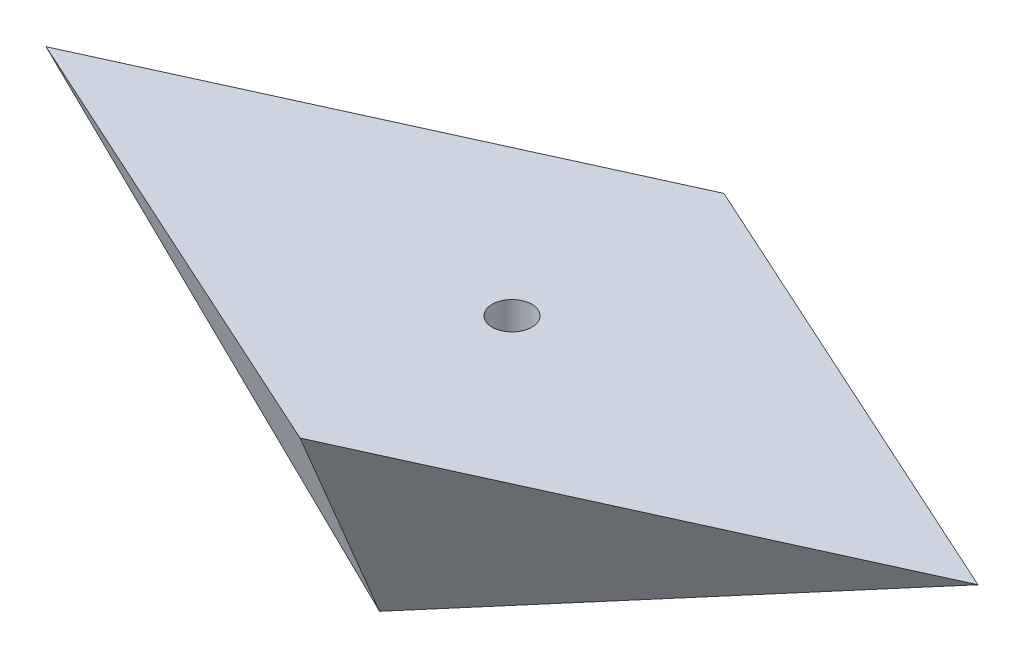
ISO-10303-21;
HEADER;
FILE_DESCRIPTION(('STEP AP214'),'2;1');
FILE_NAME('part.step','',(''),(''),'','','');
FILE_SCHEMA(('AUTOMOTIVE_DESIGN { 1 0 10303 214 1 1 1 1 }'));
ENDSEC;
DATA;
#1=APPLICATION_CONTEXT('core data for automotive mechanical design processes');
#2=APPLICATION_PROTOCOL_DEFINITION('international standard','automotive_design',2000,#1);
#3=PRODUCT_CONTEXT('',#1,'mechanical');
#4=PRODUCT('Part','Part','',(#3));
#5=PRODUCT_RELATED_PRODUCT_CATEGORY('part','',(#4));
#6=PRODUCT_DEFINITION_FORMATION('','',#4);
#7=PRODUCT_DEFINITION_CONTEXT('part definition',#1,'design');
#8=PRODUCT_DEFINITION('design','',#6,#7);
#9=PRODUCT_DEFINITION_SHAPE('','',#8);
#10=(LENGTH_UNIT() NAMED_UNIT(*) SI_UNIT(.MILLI.,.METRE.));
#11=(NAMED_UNIT(*) PLANE_ANGLE_UNIT() SI_UNIT($,.RADIAN.));
#12=(NAMED_UNIT(*) SI_UNIT($,.STERADIAN.) SOLID_ANGLE_UNIT());
#13=UNCERTAINTY_MEASURE_WITH_UNIT(LENGTH_MEASURE(1.E-05),#10,'distance_accuracy_value','');
#14=(GEOMETRIC_REPRESENTATION_CONTEXT(3) GLOBAL_UNCERTAINTY_ASSIGNED_CONTEXT((#13)) GLOBAL_UNIT_ASSIGNED_CONTEXT((#10,
#11,#12)) REPRESENTATION_CONTEXT('',''));
#15=CARTESIAN_POINT('',(0.,0.,0.));
#16=DIRECTION('',(0.,0.,1.));
#17=DIRECTION('',(1.,0.,0.));
#18=AXIS2_PLACEMENT_3D('',#15,#16,#17);
#19=CARTESIAN_POINT('',(111.717777578847,117.412759364225,50.8));
#20=DIRECTION('',(0.377193882835863,0.926134317877923,0.));
#21=DIRECTION('',(-0.926134317877923,0.377193882835863,0.));
#22=AXIS2_PLACEMENT_3D('',#19,#20,#21);
#23=PLANE('',#22);
#24=CARTESIAN_POINT('',(109.594367063863,118.277577179028,0.));
#25=DIRECTION('',(0.377193882835863,0.926134317877923,0.));
#26=DIRECTION('',(-0.926134317877923,0.377193882835863,0.));
#27=AXIS2_PLACEMENT_3D('',#24,#25,#26);
#28=ELLIPSE('',#27,31.8669543266091,29.4365932021796);
#29=CARTESIAN_POINT('',(111.717777578847,117.412759364225,29.3603046212788));
#30=VERTEX_POINT('',#29);
#31=CARTESIAN_POINT('',(111.717777578847,117.412759364225,-29.3603046212788));
#32=VERTEX_POINT('',#31);
#33=EDGE_CURVE('E45',#30,#32,#28,.F.);
#34=ORIENTED_EDGE('',*,*,#33,.F.);
#35=DIRECTION('',(0.,0.,-1.));
#36=VECTOR('',#35,1.);
#37=CARTESIAN_POINT('',(111.717777578847,117.412759364225,50.8));
#38=LINE('',#37,#36);
#39=CARTESIAN_POINT('',(111.717777578847,117.412759364225,31.75));
#40=VERTEX_POINT('',#39);
#41=EDGE_CURVE('E77',#40,#30,#38,.T.);
#42=ORIENTED_EDGE('',*,*,#41,.F.);
#43=DIRECTION('',(-0.895630361178674,0.364770300589596,-0.254536606292166));
#44=VECTOR('',#43,1.);
#45=CARTESIAN_POINT('',(53.2235467898234,141.236156909156,15.1260403420059));
#46=LINE('',#45,#44);
#47=CARTESIAN_POINT('',(0.,162.912922238347,0.));
#48=VERTEX_POINT('',#47);
#49=EDGE_CURVE('E91',#40,#48,#46,.T.);
#50=ORIENTED_EDGE('',*,*,#49,.T.);
#51=DIRECTION('',(0.895630361178674,-0.364770300589596,-0.254536606292166));
#52=VECTOR('',#51,1.);
#53=CARTESIAN_POINT('',(53.2235467898234,141.236156909156,-15.1260403420059));
#54=LINE('',#53,#52);
#55=CARTESIAN_POINT('',(111.717777578847,117.412759364225,-31.75));
#56=VERTEX_POINT('',#55);
#57=EDGE_CURVE('E111',#48,#56,#54,.T.);
#58=ORIENTED_EDGE('',*,*,#57,.T.);
#59=EDGE_CURVE('E79',#32,#56,#38,.T.);
#60=ORIENTED_EDGE('',*,*,#59,.F.);
#61=EDGE_LOOP('',(#34,#42,#50,#58,#60));
#62=FACE_BOUND('',#61,.T.);
#63=ADVANCED_FACE('F33',(#62),#23,.F.);
#64=CARTESIAN_POINT('',(223.435555157695,162.912922238347,50.8));
#65=DIRECTION('',(-0.377193882835863,0.926134317877923,0.));
#66=DIRECTION('',(-0.926134317877923,-0.377193882835863,0.));
#67=AXIS2_PLACEMENT_3D('',#64,#65,#66);
#68=PLANE('',#67);
#69=CARTESIAN_POINT('',(113.841188093832,118.277577179028,0.));
#70=DIRECTION('',(-0.377193882835863,0.926134317877923,0.));
#71=DIRECTION('',(0.926134317877923,0.377193882835863,0.));
#72=AXIS2_PLACEMENT_3D('',#69,#70,#71);
#73=ELLIPSE('',#72,31.8669543266091,29.4365932021796);
#74=EDGE_CURVE('E11',#32,#30,#73,.F.);
#75=ORIENTED_EDGE('',*,*,#74,.F.);
#76=ORIENTED_EDGE('',*,*,#59,.T.);
#77=DIRECTION('',(0.895630361178674,0.364770300589596,0.254536606292166));
#78=VECTOR('',#77,1.);
#79=CARTESIAN_POINT('',(235.016467359129,167.62956987327,3.29127530429085));
#80=LINE('',#79,#78);
#81=CARTESIAN_POINT('',(223.435555157695,162.912922238347,0.));
#82=VERTEX_POINT('',#81);
#83=EDGE_CURVE('E100',#56,#82,#80,.T.);
#84=ORIENTED_EDGE('',*,*,#83,.T.);
#85=DIRECTION('',(-0.895630361178674,-0.364770300589596,0.254536606292166));
#86=VECTOR('',#85,1.);
#87=CARTESIAN_POINT('',(211.854642956261,158.196274603423,3.29127530429085));
#88=LINE('',#87,#86);
#89=EDGE_CURVE('E86',#82,#40,#88,.T.);
#90=ORIENTED_EDGE('',*,*,#89,.T.);
#91=ORIENTED_EDGE('',*,*,#41,.T.);
#92=EDGE_LOOP('',(#75,#76,#84,#90,#91));
#93=FACE_BOUND('',#92,.T.);
#94=ADVANCED_FACE('F84',(#93),#68,.F.);
#95=CARTESIAN_POINT('',(111.717777578847,117.412759364225,0.));
#96=DIRECTION('',(0.,1.,0.));
#97=DIRECTION('',(0.,0.,1.));
#98=AXIS2_PLACEMENT_3D('',#95,#96,#97);
#99=CYLINDRICAL_SURFACE('',#98,4.7625);
#100=CARTESIAN_POINT('',(111.717777578847,162.912922238347,0.));
#101=DIRECTION('',(0.,1.,0.));
#102=DIRECTION('',(0.,0.,1.));
#103=AXIS2_PLACEMENT_3D('',#100,#101,#102);
#104=CIRCLE('',#103,4.7625);
#105=CARTESIAN_POINT('',(111.717777578847,162.912922238347,4.7625));
#106=VERTEX_POINT('',#105);
#107=EDGE_CURVE('E80',#106,#106,#104,.T.);
#108=CARTESIAN_POINT('',(111.717777578847,131.804308366202,0.));
#109=DIRECTION('',(0.,-1.,0.));
#110=DIRECTION('',(0.,0.,-1.));
#111=AXIS2_PLACEMENT_3D('',#108,#109,#110);
#112=CIRCLE('',#111,4.7625);
#113=CARTESIAN_POINT('',(111.717777578847,131.804308366202,4.7625));
#114=VERTEX_POINT('',#113);
#115=EDGE_CURVE('E150',#114,#114,#112,.T.);
#116=CARTESIAN_POINT('',(111.717777578847,162.912922238347,4.7625));
#117=CARTESIAN_POINT('',(111.717777578847,162.588874177178,4.7625));
#118=CARTESIAN_POINT('',(111.717777578847,162.26482611601,4.7625));
#119=CARTESIAN_POINT('',(111.717777578847,161.616729993674,4.7625));
#120=CARTESIAN_POINT('',(111.717777578847,161.292681932506,4.7625));
#121=CARTESIAN_POINT('',(111.717777578847,160.644585810169,4.7625));
#122=CARTESIAN_POINT('',(111.717777578847,160.320537749001,4.7625));
#123=CARTESIAN_POINT('',(111.717777578847,159.672441626665,4.7625));
#124=CARTESIAN_POINT('',(111.717777578847,159.348393565497,4.7625));
#125=CARTESIAN_POINT('',(111.717777578847,158.70029744316,4.7625));
#126=CARTESIAN_POINT('',(111.717777578847,158.376249381992,4.7625));
#127=CARTESIAN_POINT('',(111.717777578847,157.728153259656,4.7625));
#128=CARTESIAN_POINT('',(111.717777578847,157.404105198488,4.7625));
#129=CARTESIAN_POINT('',(111.717777578847,156.756009076151,4.7625));
#130=CARTESIAN_POINT('',(111.717777578847,156.431961014983,4.7625));
#131=CARTESIAN_POINT('',(111.717777578847,155.783864892647,4.7625));
#132=CARTESIAN_POINT('',(111.717777578847,155.459816831479,4.7625));
#133=CARTESIAN_POINT('',(111.717777578847,154.811720709142,4.7625));
#134=CARTESIAN_POINT('',(111.717777578847,154.487672647974,4.7625));
#135=CARTESIAN_POINT('',(111.717777578847,153.839576525638,4.7625));
#136=CARTESIAN_POINT('',(111.717777578847,153.51552846447,4.7625));
#137=CARTESIAN_POINT('',(111.717777578847,152.867432342133,4.7625));
#138=CARTESIAN_POINT('',(111.717777578847,152.543384280965,4.7625));
#139=CARTESIAN_POINT('',(111.717777578847,151.895288158629,4.7625));
#140=CARTESIAN_POINT('',(111.717777578847,151.571240097461,4.7625));
#141=CARTESIAN_POINT('',(111.717777578847,150.923143975124,4.7625));
#142=CARTESIAN_POINT('',(111.717777578847,150.599095913956,4.7625));
#143=CARTESIAN_POINT('',(111.717777578847,149.95099979162,4.7625));
#144=CARTESIAN_POINT('',(111.717777578847,149.626951730451,4.7625));
#145=CARTESIAN_POINT('',(111.717777578847,148.978855608115,4.7625));
#146=CARTESIAN_POINT('',(111.717777578847,148.654807546947,4.7625));
#147=CARTESIAN_POINT('',(111.717777578847,148.006711424611,4.7625));
#148=CARTESIAN_POINT('',(111.717777578847,147.682663363442,4.7625));
#149=CARTESIAN_POINT('',(111.717777578847,147.034567241106,4.7625));
#150=CARTESIAN_POINT('',(111.717777578847,146.710519179938,4.7625));
#151=CARTESIAN_POINT('',(111.717777578847,146.062423057602,4.7625));
#152=CARTESIAN_POINT('',(111.717777578847,145.738374996433,4.7625));
#153=CARTESIAN_POINT('',(111.717777578847,145.090278874097,4.7625));
#154=CARTESIAN_POINT('',(111.717777578847,144.766230812929,4.7625));
#155=CARTESIAN_POINT('',(111.717777578847,144.118134690593,4.7625));
#156=CARTESIAN_POINT('',(111.717777578847,143.794086629424,4.7625));
#157=CARTESIAN_POINT('',(111.717777578847,143.145990507088,4.7625));
#158=CARTESIAN_POINT('',(111.717777578847,142.82194244592,4.7625));
#159=CARTESIAN_POINT('',(111.717777578847,142.173846323584,4.7625));
#160=CARTESIAN_POINT('',(111.717777578847,141.849798262415,4.7625));
#161=CARTESIAN_POINT('',(111.717777578847,141.201702140079,4.7625));
#162=CARTESIAN_POINT('',(111.717777578847,140.877654078911,4.7625));
#163=CARTESIAN_POINT('',(111.717777578847,140.229557956574,4.7625));
#164=CARTESIAN_POINT('',(111.717777578847,139.905509895406,4.7625));
#165=CARTESIAN_POINT('',(111.717777578847,139.25741377307,4.7625));
#166=CARTESIAN_POINT('',(111.717777578847,138.933365711902,4.7625));
#167=CARTESIAN_POINT('',(111.717777578847,138.285269589565,4.7625));
#168=CARTESIAN_POINT('',(111.717777578847,137.961221528397,4.7625));
#169=CARTESIAN_POINT('',(111.717777578847,137.313125406061,4.7625));
#170=CARTESIAN_POINT('',(111.717777578847,136.989077344893,4.7625));
#171=CARTESIAN_POINT('',(111.717777578847,136.340981222556,4.7625));
#172=CARTESIAN_POINT('',(111.717777578847,136.016933161388,4.7625));
#173=CARTESIAN_POINT('',(111.717777578847,135.368837039052,4.7625));
#174=CARTESIAN_POINT('',(111.717777578847,135.044788977884,4.7625));
#175=CARTESIAN_POINT('',(111.717777578847,134.396692855547,4.7625));
#176=CARTESIAN_POINT('',(111.717777578847,134.072644794379,4.7625));
#177=CARTESIAN_POINT('',(111.717777578847,133.424548672043,4.7625));
#178=CARTESIAN_POINT('',(111.717777578847,133.100500610875,4.7625));
#179=CARTESIAN_POINT('',(111.717777578847,132.452404488538,4.7625));
#180=CARTESIAN_POINT('',(111.717777578847,132.12835642737,4.7625));
#181=CARTESIAN_POINT('',(111.717777578847,131.804308366202,4.7625));
#182=B_SPLINE_CURVE_WITH_KNOTS('',3,(#116,#117,#118,#119,#120,#121,#122,#123,#124,#125,#126,
#127,#128,#129,#130,#131,#132,#133,#134,#135,#136,#137,#138,#139,#140,#141,#142,#143,#144,#145,
#146,#147,#148,#149,#150,#151,#152,#153,#154,#155,#156,#157,#158,#159,#160,#161,#162,#163,#164,
#165,#166,#167,#168,#169,#170,#171,#172,#173,#174,#175,#176,#177,#178,#179,#180,#181),
.UNSPECIFIED.,.F.,.F.,(4,2,2,2,2,2,2,2,2,2,2,2,2,2,2,2,2,2,2,2,2,2,2,2,2,2,2,2,2,2,2,2,4),(0.,
0.972144183504525,1.94428836700905,2.91643255051355,3.88857673401807,4.8607209175226,
5.83286510102712,6.80500928453162,7.77715346803615,8.74929765154067,9.72144183504517,
10.6935860185497,11.6657302020542,12.6378743855587,13.6100185690632,14.5821627525678,
15.5543069360723,16.5264511195768,17.4985953030813,18.4707394865858,19.4428836700903,
20.4150278535949,21.3871720370994,22.3593162206039,23.3314604041084,24.3036045876129,
25.2757487711174,26.247892954622,27.2200371381265,28.192181321631,29.1643255051355,
30.13646968864,31.1086138721445),.UNSPECIFIED.);
#183=EDGE_CURVE('BSEAM134',#106,#114,#182,.T.);
#184=ORIENTED_EDGE('',*,*,#107,.T.);
#185=ORIENTED_EDGE('',*,*,#115,.T.);
#186=ORIENTED_EDGE('',*,*,#183,.T.);
#187=ORIENTED_EDGE('',*,*,#183,.F.);
#188=EDGE_LOOP('',(#184,#186,#185,#187));
#189=FACE_BOUND('',#188,.T.);
#190=ADVANCED_FACE('F134',(#189),#99,.F.);
#191=CARTESIAN_POINT('',(0.,162.912922238347,50.8));
#192=DIRECTION('',(0.,-1.,0.));
#193=DIRECTION('',(0.,0.,-1.));
#194=AXIS2_PLACEMENT_3D('',#191,#192,#193);
#195=PLANE('',#194);
#196=ORIENTED_EDGE('',*,*,#107,.F.);
#197=EDGE_LOOP('',(#196));
#198=FACE_BOUND('',#197,.T.);
#199=DIRECTION('',(0.910307557270715,0.,-0.413932544233748));
#200=VECTOR('',#199,1.);
#201=CARTESIAN_POINT('',(19.1417408993868,162.912922238347,92.8959203202682));
#202=LINE('',#201,#200);
#203=CARTESIAN_POINT('',(111.717777578848,162.912922238347,50.8));
#204=VERTEX_POINT('',#203);
#205=EDGE_CURVE('E53',#204,#82,#202,.T.);
#206=ORIENTED_EDGE('',*,*,#205,.T.);
#207=DIRECTION('',(-0.910307557270715,0.,-0.413932544233748));
#208=VECTOR('',#207,1.);
#209=CARTESIAN_POINT('',(57.4252226981604,162.912922238347,-75.4877609608044));
#210=LINE('',#209,#208);
#211=CARTESIAN_POINT('',(111.717777578847,162.912922238347,-50.8));
#212=VERTEX_POINT('',#211);
#213=EDGE_CURVE('E99',#82,#212,#210,.T.);
#214=ORIENTED_EDGE('',*,*,#213,.T.);
#215=DIRECTION('',(-0.910307557270715,0.,0.413932544233748));
#216=VECTOR('',#215,1.);
#217=CARTESIAN_POINT('',(0.,162.912922238347,0.));
#218=LINE('',#217,#216);
#219=EDGE_CURVE('E107',#212,#48,#218,.T.);
#220=ORIENTED_EDGE('',*,*,#219,.T.);
#221=DIRECTION('',(0.910307557270715,0.,0.413932544233748));
#222=VECTOR('',#221,1.);
#223=CARTESIAN_POINT('',(0.,162.912922238347,0.));
#224=LINE('',#223,#222);
#225=EDGE_CURVE('E117',#48,#204,#224,.T.);
#226=ORIENTED_EDGE('',*,*,#225,.T.);
#227=EDGE_LOOP('',(#206,#214,#220,#226));
#228=FACE_BOUND('',#227,.T.);
#229=ADVANCED_FACE('F105',(#198,#228),#195,.F.);
#230=CARTESIAN_POINT('',(22.4415015660844,20.6629591148215,-49.3526511908499));
#231=DIRECTION('',(-0.386792359959196,-0.356138144153457,0.850621709431476));
#232=DIRECTION('',(0.910307557270715,0.,0.413932544233748));
#233=AXIS2_PLACEMENT_3D('',#230,#231,#232);
#234=PLANE('',#233);
#235=DIRECTION('',(0.,-0.922416289325795,-0.38619708593726));
#236=VECTOR('',#235,1.);
#237=CARTESIAN_POINT('',(111.717777578847,6.20145561261823,-14.8119286315362));
#238=LINE('',#237,#236);
#239=EDGE_CURVE('E88',#204,#40,#238,.T.);
#240=ORIENTED_EDGE('',*,*,#239,.F.);
#241=ORIENTED_EDGE('',*,*,#225,.F.);
#242=ORIENTED_EDGE('',*,*,#49,.F.);
#243=EDGE_LOOP('',(#240,#241,#242));
#244=FACE_BOUND('',#243,.T.);
#245=ADVANCED_FACE('F119',(#244),#234,.T.);
#246=CARTESIAN_POINT('',(10.9863186417459,-10.1156267216929,24.1607697328526));
#247=DIRECTION('',(-0.386792359959196,0.356138144153457,-0.850621709431476));
#248=DIRECTION('',(-0.910307557270715,0.,0.413932544233748));
#249=AXIS2_PLACEMENT_3D('',#246,#247,#248);
#250=PLANE('',#249);
#251=ORIENTED_EDGE('',*,*,#205,.F.);
#252=ORIENTED_EDGE('',*,*,#239,.T.);
#253=ORIENTED_EDGE('',*,*,#89,.F.);
#254=EDGE_LOOP('',(#251,#252,#253));
#255=FACE_BOUND('',#254,.T.);
#256=ADVANCED_FACE('F120',(#255),#250,.F.);
#257=CARTESIAN_POINT('',(22.4415015660844,20.6629591148215,49.3526511908499));
#258=DIRECTION('',(-0.386792359959196,-0.356138144153457,-0.850621709431476));
#259=DIRECTION('',(0.910307557270715,0.,-0.413932544233748));
#260=AXIS2_PLACEMENT_3D('',#257,#258,#259);
#261=PLANE('',#260);
#262=DIRECTION('',(0.,0.922416289325795,-0.38619708593726));
#263=VECTOR('',#262,1.);
#264=CARTESIAN_POINT('',(111.717777578847,6.20145561261823,14.8119286315362));
#265=LINE('',#264,#263);
#266=EDGE_CURVE('E40',#56,#212,#265,.T.);
#267=ORIENTED_EDGE('',*,*,#266,.F.);
#268=ORIENTED_EDGE('',*,*,#57,.F.);
#269=ORIENTED_EDGE('',*,*,#219,.F.);
#270=EDGE_LOOP('',(#267,#268,#269));
#271=FACE_BOUND('',#270,.T.);
#272=ADVANCED_FACE('F110',(#271),#261,.T.);
#273=CARTESIAN_POINT('',(10.9863186417459,-10.1156267216929,-24.1607697328526));
#274=DIRECTION('',(-0.386792359959196,0.356138144153457,0.850621709431476));
#275=DIRECTION('',(-0.910307557270715,0.,-0.413932544233748));
#276=AXIS2_PLACEMENT_3D('',#273,#274,#275);
#277=PLANE('',#276);
#278=ORIENTED_EDGE('',*,*,#266,.T.);
#279=ORIENTED_EDGE('',*,*,#213,.F.);
#280=ORIENTED_EDGE('',*,*,#83,.F.);
#281=EDGE_LOOP('',(#278,#279,#280));
#282=FACE_BOUND('',#281,.T.);
#283=ADVANCED_FACE('F98',(#282),#277,.F.);
#284=CARTESIAN_POINT('',(111.717777578847,131.804308366202,0.));
#285=DIRECTION('',(0.,1.,0.));
#286=DIRECTION('',(0.,0.,1.));
#287=AXIS2_PLACEMENT_3D('',#284,#285,#286);
#288=CONICAL_SURFACE('',#287,31.9026602809341,0.174852152218462);
#289=CARTESIAN_POINT('',(111.717777578847,131.804308366202,0.));
#290=DIRECTION('',(0.,-1.,0.));
#291=DIRECTION('',(0.,0.,-1.));
#292=AXIS2_PLACEMENT_3D('',#289,#290,#291);
#293=CIRCLE('',#292,31.9026602809341);
#294=CARTESIAN_POINT('',(111.717777578847,131.804308366202,-31.9026602809341));
#295=VERTEX_POINT('',#294);
#296=EDGE_CURVE('E81',#295,#295,#293,.T.);
#297=ORIENTED_EDGE('',*,*,#296,.F.);
#298=EDGE_LOOP('',(#297));
#299=FACE_BOUND('',#298,.T.);
#300=ORIENTED_EDGE('',*,*,#33,.T.);
#301=ORIENTED_EDGE('',*,*,#74,.T.);
#302=EDGE_LOOP('',(#300,#301));
#303=FACE_BOUND('',#302,.T.);
#304=ADVANCED_FACE('F70',(#299,#303),#288,.F.);
#305=CARTESIAN_POINT('',(111.717777578847,131.804308366202,0.));
#306=DIRECTION('',(0.,-1.,0.));
#307=DIRECTION('',(0.,0.,-1.));
#308=AXIS2_PLACEMENT_3D('',#305,#306,#307);
#309=PLANE('',#308);
#310=ORIENTED_EDGE('',*,*,#115,.F.);
#311=EDGE_LOOP('',(#310));
#312=FACE_BOUND('',#311,.T.);
#313=ORIENTED_EDGE('',*,*,#296,.T.);
#314=EDGE_LOOP('',(#313));
#315=FACE_BOUND('',#314,.T.);
#316=ADVANCED_FACE('F155',(#312,#315),#309,.T.);
#317=CLOSED_SHELL('',(#63,#94,#190,#229,#245,#256,#272,#283,#304,#316));
#318=MANIFOLD_SOLID_BREP('B2',#317);
#319=ADVANCED_BREP_SHAPE_REPRESENTATION('',(#18,#318),#14);
#320=SHAPE_DEFINITION_REPRESENTATION(#9,#319);
ENDSEC;
END-ISO-10303-21;
